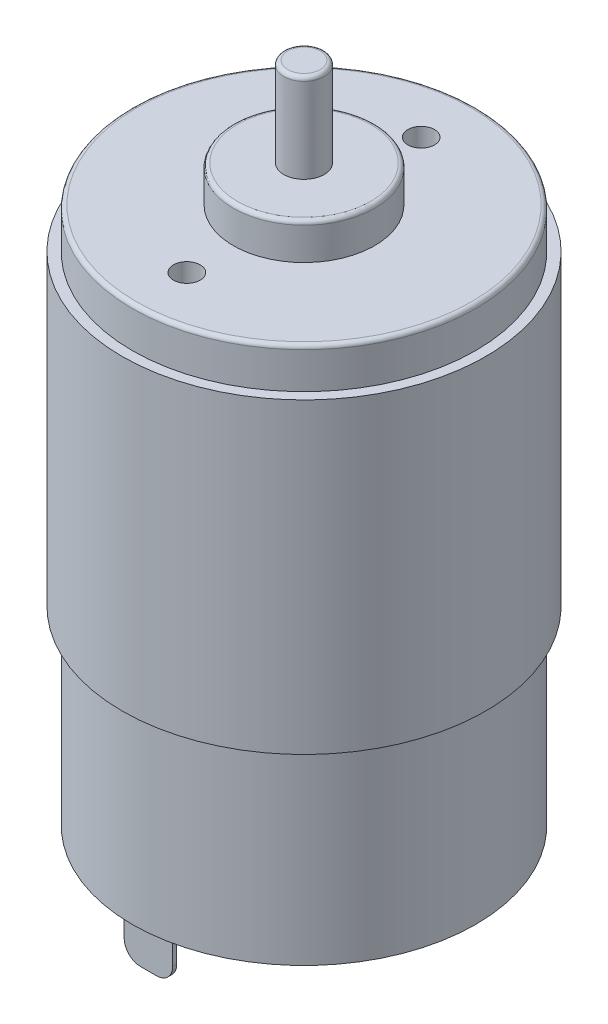
ISO-10303-21;
HEADER;
FILE_DESCRIPTION(('STEP AP214'),'2;1');
FILE_NAME('part.step','',(''),(''),'','','');
FILE_SCHEMA(('AUTOMOTIVE_DESIGN { 1 0 10303 214 1 1 1 1 }'));
ENDSEC;
DATA;
#1=APPLICATION_CONTEXT('core data for automotive mechanical design processes');
#2=APPLICATION_PROTOCOL_DEFINITION('international standard','automotive_design',2000,#1);
#3=PRODUCT_CONTEXT('',#1,'mechanical');
#4=PRODUCT('Part','Part','',(#3));
#5=PRODUCT_RELATED_PRODUCT_CATEGORY('part','',(#4));
#6=PRODUCT_DEFINITION_FORMATION('','',#4);
#7=PRODUCT_DEFINITION_CONTEXT('part definition',#1,'design');
#8=PRODUCT_DEFINITION('design','',#6,#7);
#9=PRODUCT_DEFINITION_SHAPE('','',#8);
#10=(LENGTH_UNIT() NAMED_UNIT(*) SI_UNIT(.MILLI.,.METRE.));
#11=(NAMED_UNIT(*) PLANE_ANGLE_UNIT() SI_UNIT($,.RADIAN.));
#12=(NAMED_UNIT(*) SI_UNIT($,.STERADIAN.) SOLID_ANGLE_UNIT());
#13=UNCERTAINTY_MEASURE_WITH_UNIT(LENGTH_MEASURE(1.E-05),#10,'distance_accuracy_value','');
#14=(GEOMETRIC_REPRESENTATION_CONTEXT(3) GLOBAL_UNCERTAINTY_ASSIGNED_CONTEXT((#13)) GLOBAL_UNIT_ASSIGNED_CONTEXT((#10,
#11,#12)) REPRESENTATION_CONTEXT('',''));
#15=CARTESIAN_POINT('',(0.,0.,0.));
#16=DIRECTION('',(0.,0.,1.));
#17=DIRECTION('',(1.,0.,0.));
#18=AXIS2_PLACEMENT_3D('',#15,#16,#17);
#19=CARTESIAN_POINT('',(21.25,11.5,0.));
#20=DIRECTION('',(0.,-1.,0.));
#21=DIRECTION('',(0.,0.,-1.));
#22=AXIS2_PLACEMENT_3D('',#19,#20,#21);
#23=PLANE('',#22);
#24=CARTESIAN_POINT('',(0.,11.5,0.));
#25=DIRECTION('',(0.,-1.,0.));
#26=DIRECTION('',(0.,0.,-1.));
#27=AXIS2_PLACEMENT_3D('',#24,#25,#26);
#28=CIRCLE('',#27,21.25);
#29=CARTESIAN_POINT('',(0.,11.5,-21.25));
#30=VERTEX_POINT('',#29);
#31=EDGE_CURVE('E196',#30,#30,#28,.T.);
#32=ORIENTED_EDGE('',*,*,#31,.T.);
#33=EDGE_LOOP('',(#32));
#34=FACE_BOUND('',#33,.T.);
#35=CARTESIAN_POINT('',(0.,11.5,0.));
#36=DIRECTION('',(0.,-1.,0.));
#37=DIRECTION('',(0.,0.,-1.));
#38=AXIS2_PLACEMENT_3D('',#35,#36,#37);
#39=CIRCLE('',#38,8.75000000000001);
#40=CARTESIAN_POINT('',(0.,11.5,-8.75000000000001));
#41=VERTEX_POINT('',#40);
#42=EDGE_CURVE('E193',#41,#41,#39,.T.);
#43=ORIENTED_EDGE('',*,*,#42,.F.);
#44=EDGE_LOOP('',(#43));
#45=FACE_BOUND('',#44,.T.);
#46=DIRECTION('',(1.,0.,0.));
#47=VECTOR('',#46,1.);
#48=CARTESIAN_POINT('',(-3.,11.5,18.75));
#49=LINE('',#48,#47);
#50=CARTESIAN_POINT('',(-3.,11.5,18.75));
#51=VERTEX_POINT('',#50);
#52=CARTESIAN_POINT('',(3.,11.5,18.75));
#53=VERTEX_POINT('',#52);
#54=EDGE_CURVE('E175',#51,#53,#49,.T.);
#55=ORIENTED_EDGE('',*,*,#54,.F.);
#56=DIRECTION('',(0.,0.,-1.));
#57=VECTOR('',#56,1.);
#58=CARTESIAN_POINT('',(-3.,11.5,18.75));
#59=LINE('',#58,#57);
#60=CARTESIAN_POINT('',(-3.,11.5,19.25));
#61=VERTEX_POINT('',#60);
#62=EDGE_CURVE('E138',#61,#51,#59,.T.);
#63=ORIENTED_EDGE('',*,*,#62,.F.);
#64=DIRECTION('',(-1.,0.,0.));
#65=VECTOR('',#64,1.);
#66=CARTESIAN_POINT('',(-3.,11.5,19.25));
#67=LINE('',#66,#65);
#68=CARTESIAN_POINT('',(3.,11.5,19.25));
#69=VERTEX_POINT('',#68);
#70=EDGE_CURVE('E169',#69,#61,#67,.T.);
#71=ORIENTED_EDGE('',*,*,#70,.F.);
#72=DIRECTION('',(0.,0.,1.));
#73=VECTOR('',#72,1.);
#74=CARTESIAN_POINT('',(3.,11.5,18.75));
#75=LINE('',#74,#73);
#76=EDGE_CURVE('E178',#53,#69,#75,.T.);
#77=ORIENTED_EDGE('',*,*,#76,.F.);
#78=EDGE_LOOP('',(#55,#63,#71,#77));
#79=FACE_BOUND('',#78,.T.);
#80=DIRECTION('',(1.,0.,0.));
#81=VECTOR('',#80,1.);
#82=CARTESIAN_POINT('',(-3.,11.5,-19.25));
#83=LINE('',#82,#81);
#84=CARTESIAN_POINT('',(-3.,11.5,-19.25));
#85=VERTEX_POINT('',#84);
#86=CARTESIAN_POINT('',(3.,11.5,-19.25));
#87=VERTEX_POINT('',#86);
#88=EDGE_CURVE('E132',#85,#87,#83,.T.);
#89=ORIENTED_EDGE('',*,*,#88,.F.);
#90=DIRECTION('',(0.,0.,-1.));
#91=VECTOR('',#90,1.);
#92=CARTESIAN_POINT('',(-3.,11.5,-19.25));
#93=LINE('',#92,#91);
#94=CARTESIAN_POINT('',(-3.,11.5,-18.75));
#95=VERTEX_POINT('',#94);
#96=EDGE_CURVE('E142',#95,#85,#93,.T.);
#97=ORIENTED_EDGE('',*,*,#96,.F.);
#98=DIRECTION('',(-1.,0.,0.));
#99=VECTOR('',#98,1.);
#100=CARTESIAN_POINT('',(-3.,11.5,-18.75));
#101=LINE('',#100,#99);
#102=CARTESIAN_POINT('',(3.,11.5,-18.75));
#103=VERTEX_POINT('',#102);
#104=EDGE_CURVE('E154',#103,#95,#101,.T.);
#105=ORIENTED_EDGE('',*,*,#104,.F.);
#106=DIRECTION('',(0.,0.,1.));
#107=VECTOR('',#106,1.);
#108=CARTESIAN_POINT('',(3.,11.5,-19.25));
#109=LINE('',#108,#107);
#110=EDGE_CURVE('E152',#87,#103,#109,.T.);
#111=ORIENTED_EDGE('',*,*,#110,.F.);
#112=EDGE_LOOP('',(#89,#97,#105,#111));
#113=FACE_BOUND('',#112,.T.);
#114=ADVANCED_FACE('F38',(#34,#45,#79,#113),#23,.T.);
#115=CARTESIAN_POINT('',(2.50000000000001,0.,0.));
#116=DIRECTION('',(0.,-1.,0.));
#117=DIRECTION('',(0.,0.,-1.));
#118=AXIS2_PLACEMENT_3D('',#115,#116,#117);
#119=PLANE('',#118);
#120=CARTESIAN_POINT('',(0.,0.,0.));
#121=DIRECTION('',(0.,-1.,0.));
#122=DIRECTION('',(0.,0.,-1.));
#123=AXIS2_PLACEMENT_3D('',#120,#121,#122);
#124=CIRCLE('',#123,2.00000000000001);
#125=CARTESIAN_POINT('',(0.,0.,-2.00000000000001));
#126=VERTEX_POINT('',#125);
#127=EDGE_CURVE('E217',#126,#126,#124,.T.);
#128=ORIENTED_EDGE('',*,*,#127,.T.);
#129=EDGE_LOOP('',(#128));
#130=FACE_BOUND('',#129,.T.);
#131=ADVANCED_FACE('F307',(#130),#119,.T.);
#132=CARTESIAN_POINT('',(0.,93.5,0.));
#133=DIRECTION('',(0.,1.,0.));
#134=DIRECTION('',(0.,0.,1.));
#135=AXIS2_PLACEMENT_3D('',#132,#133,#134);
#136=PLANE('',#135);
#137=CARTESIAN_POINT('',(0.,93.5,0.));
#138=DIRECTION('',(0.,1.,0.));
#139=DIRECTION('',(0.,0.,1.));
#140=AXIS2_PLACEMENT_3D('',#137,#138,#139);
#141=CIRCLE('',#140,2.);
#142=CARTESIAN_POINT('',(0.,93.5,2.));
#143=VERTEX_POINT('',#142);
#144=EDGE_CURVE('E244',#143,#143,#141,.T.);
#145=ORIENTED_EDGE('',*,*,#144,.T.);
#146=EDGE_LOOP('',(#145));
#147=FACE_BOUND('',#146,.T.);
#148=ADVANCED_FACE('F315',(#147),#136,.T.);
#149=CARTESIAN_POINT('',(0.,0.,0.));
#150=DIRECTION('',(0.,-1.,0.));
#151=DIRECTION('',(0.,0.,-1.));
#152=AXIS2_PLACEMENT_3D('',#149,#150,#151);
#153=CYLINDRICAL_SURFACE('',#152,2.5);
#154=CARTESIAN_POINT('',(0.,93.,0.));
#155=DIRECTION('',(0.,1.,0.));
#156=DIRECTION('',(0.,0.,1.));
#157=AXIS2_PLACEMENT_3D('',#154,#155,#156);
#158=CIRCLE('',#157,2.5);
#159=CARTESIAN_POINT('',(0.,93.,2.5));
#160=VERTEX_POINT('',#159);
#161=EDGE_CURVE('E241',#160,#160,#158,.F.);
#162=ORIENTED_EDGE('',*,*,#161,.T.);
#163=EDGE_LOOP('',(#162));
#164=FACE_BOUND('',#163,.T.);
#165=CARTESIAN_POINT('',(0.,82.5,0.));
#166=DIRECTION('',(0.,-1.,0.));
#167=DIRECTION('',(0.,0.,-1.));
#168=AXIS2_PLACEMENT_3D('',#165,#166,#167);
#169=CIRCLE('',#168,2.5);
#170=CARTESIAN_POINT('',(0.,82.5,-2.5));
#171=VERTEX_POINT('',#170);
#172=EDGE_CURVE('E214',#171,#171,#169,.T.);
#173=ORIENTED_EDGE('',*,*,#172,.F.);
#174=EDGE_LOOP('',(#173));
#175=FACE_BOUND('',#174,.T.);
#176=ADVANCED_FACE('F354',(#164,#175),#153,.T.);
#177=CARTESIAN_POINT('',(2.5,82.5,0.));
#178=DIRECTION('',(0.,1.,0.));
#179=DIRECTION('',(0.,0.,1.));
#180=AXIS2_PLACEMENT_3D('',#177,#178,#179);
#181=PLANE('',#180);
#182=CARTESIAN_POINT('',(0.,82.5,0.));
#183=DIRECTION('',(0.,1.,0.));
#184=DIRECTION('',(0.,0.,1.));
#185=AXIS2_PLACEMENT_3D('',#182,#183,#184);
#186=CIRCLE('',#185,8.25);
#187=CARTESIAN_POINT('',(0.,82.5,8.25));
#188=VERTEX_POINT('',#187);
#189=EDGE_CURVE('E238',#188,#188,#186,.T.);
#190=ORIENTED_EDGE('',*,*,#189,.T.);
#191=EDGE_LOOP('',(#190));
#192=FACE_BOUND('',#191,.T.);
#193=ORIENTED_EDGE('',*,*,#172,.T.);
#194=EDGE_LOOP('',(#193));
#195=FACE_BOUND('',#194,.T.);
#196=ADVANCED_FACE('F350',(#192,#195),#181,.T.);
#197=CARTESIAN_POINT('',(0.,0.,0.));
#198=DIRECTION('',(0.,-1.,0.));
#199=DIRECTION('',(0.,0.,-1.));
#200=AXIS2_PLACEMENT_3D('',#197,#198,#199);
#201=CYLINDRICAL_SURFACE('',#200,8.75);
#202=CARTESIAN_POINT('',(0.,82.,0.));
#203=DIRECTION('',(0.,1.,0.));
#204=DIRECTION('',(0.,0.,1.));
#205=AXIS2_PLACEMENT_3D('',#202,#203,#204);
#206=CIRCLE('',#205,8.75);
#207=CARTESIAN_POINT('',(0.,82.,8.75));
#208=VERTEX_POINT('',#207);
#209=EDGE_CURVE('E235',#208,#208,#206,.F.);
#210=ORIENTED_EDGE('',*,*,#209,.T.);
#211=EDGE_LOOP('',(#210));
#212=FACE_BOUND('',#211,.T.);
#213=CARTESIAN_POINT('',(0.,78.,0.));
#214=DIRECTION('',(0.,-1.,0.));
#215=DIRECTION('',(0.,0.,-1.));
#216=AXIS2_PLACEMENT_3D('',#213,#214,#215);
#217=CIRCLE('',#216,8.75);
#218=CARTESIAN_POINT('',(0.,78.,-8.75));
#219=VERTEX_POINT('',#218);
#220=EDGE_CURVE('E211',#219,#219,#217,.T.);
#221=ORIENTED_EDGE('',*,*,#220,.F.);
#222=EDGE_LOOP('',(#221));
#223=FACE_BOUND('',#222,.T.);
#224=ADVANCED_FACE('F346',(#212,#223),#201,.T.);
#225=CARTESIAN_POINT('',(8.75,78.,0.));
#226=DIRECTION('',(0.,1.,0.));
#227=DIRECTION('',(0.,0.,1.));
#228=AXIS2_PLACEMENT_3D('',#225,#226,#227);
#229=PLANE('',#228);
#230=CARTESIAN_POINT('',(0.,78.,0.));
#231=DIRECTION('',(0.,1.,0.));
#232=DIRECTION('',(0.,0.,1.));
#233=AXIS2_PLACEMENT_3D('',#230,#231,#232);
#234=CIRCLE('',#233,20.75);
#235=CARTESIAN_POINT('',(0.,78.,20.75));
#236=VERTEX_POINT('',#235);
#237=EDGE_CURVE('E232',#236,#236,#234,.T.);
#238=ORIENTED_EDGE('',*,*,#237,.T.);
#239=EDGE_LOOP('',(#238));
#240=FACE_BOUND('',#239,.T.);
#241=CARTESIAN_POINT('',(0.,78.,14.5));
#242=DIRECTION('',(0.,1.,0.));
#243=DIRECTION('',(0.,0.,1.));
#244=AXIS2_PLACEMENT_3D('',#241,#242,#243);
#245=CIRCLE('',#244,1.65);
#246=CARTESIAN_POINT('',(0.,78.,16.15));
#247=VERTEX_POINT('',#246);
#248=EDGE_CURVE('E633',#247,#247,#245,.T.);
#249=ORIENTED_EDGE('',*,*,#248,.F.);
#250=EDGE_LOOP('',(#249));
#251=FACE_BOUND('',#250,.T.);
#252=CARTESIAN_POINT('',(0.,78.,-14.5));
#253=DIRECTION('',(0.,1.,0.));
#254=DIRECTION('',(0.,0.,1.));
#255=AXIS2_PLACEMENT_3D('',#252,#253,#254);
#256=CIRCLE('',#255,1.65);
#257=CARTESIAN_POINT('',(0.,78.,-12.85));
#258=VERTEX_POINT('',#257);
#259=EDGE_CURVE('E630',#258,#258,#256,.T.);
#260=ORIENTED_EDGE('',*,*,#259,.F.);
#261=EDGE_LOOP('',(#260));
#262=FACE_BOUND('',#261,.T.);
#263=ORIENTED_EDGE('',*,*,#220,.T.);
#264=EDGE_LOOP('',(#263));
#265=FACE_BOUND('',#264,.T.);
#266=ADVANCED_FACE('F342',(#240,#251,#262,#265),#229,.T.);
#267=CARTESIAN_POINT('',(0.,0.,0.));
#268=DIRECTION('',(0.,-1.,0.));
#269=DIRECTION('',(0.,0.,-1.));
#270=AXIS2_PLACEMENT_3D('',#267,#268,#269);
#271=CYLINDRICAL_SURFACE('',#270,21.25);
#272=CARTESIAN_POINT('',(0.,77.5,0.));
#273=DIRECTION('',(0.,1.,0.));
#274=DIRECTION('',(0.,0.,1.));
#275=AXIS2_PLACEMENT_3D('',#272,#273,#274);
#276=CIRCLE('',#275,21.25);
#277=CARTESIAN_POINT('',(0.,77.5,21.25));
#278=VERTEX_POINT('',#277);
#279=EDGE_CURVE('E229',#278,#278,#276,.F.);
#280=ORIENTED_EDGE('',*,*,#279,.T.);
#281=EDGE_LOOP('',(#280));
#282=FACE_BOUND('',#281,.T.);
#283=CARTESIAN_POINT('',(0.,73.,0.));
#284=DIRECTION('',(0.,-1.,0.));
#285=DIRECTION('',(0.,0.,-1.));
#286=AXIS2_PLACEMENT_3D('',#283,#284,#285);
#287=CIRCLE('',#286,21.25);
#288=CARTESIAN_POINT('',(0.,73.,-21.25));
#289=VERTEX_POINT('',#288);
#290=EDGE_CURVE('E208',#289,#289,#287,.T.);
#291=ORIENTED_EDGE('',*,*,#290,.F.);
#292=EDGE_LOOP('',(#291));
#293=FACE_BOUND('',#292,.T.);
#294=ADVANCED_FACE('F338',(#282,#293),#271,.T.);
#295=CARTESIAN_POINT('',(21.25,73.,0.));
#296=DIRECTION('',(0.,1.,0.));
#297=DIRECTION('',(0.,0.,1.));
#298=AXIS2_PLACEMENT_3D('',#295,#296,#297);
#299=PLANE('',#298);
#300=ORIENTED_EDGE('',*,*,#290,.T.);
#301=EDGE_LOOP('',(#300));
#302=FACE_BOUND('',#301,.T.);
#303=CARTESIAN_POINT('',(0.,73.,0.));
#304=DIRECTION('',(0.,-1.,0.));
#305=DIRECTION('',(0.,0.,-1.));
#306=AXIS2_PLACEMENT_3D('',#303,#304,#305);
#307=CIRCLE('',#306,22.5);
#308=CARTESIAN_POINT('',(0.,73.,-22.5));
#309=VERTEX_POINT('',#308);
#310=EDGE_CURVE('E205',#309,#309,#307,.T.);
#311=ORIENTED_EDGE('',*,*,#310,.F.);
#312=EDGE_LOOP('',(#311));
#313=FACE_BOUND('',#312,.T.);
#314=ADVANCED_FACE('F334',(#302,#313),#299,.T.);
#315=CARTESIAN_POINT('',(0.,0.,0.));
#316=DIRECTION('',(0.,-1.,0.));
#317=DIRECTION('',(0.,0.,-1.));
#318=AXIS2_PLACEMENT_3D('',#315,#316,#317);
#319=CYLINDRICAL_SURFACE('',#318,22.5);
#320=ORIENTED_EDGE('',*,*,#310,.T.);
#321=EDGE_LOOP('',(#320));
#322=FACE_BOUND('',#321,.T.);
#323=CARTESIAN_POINT('',(0.,35.,0.));
#324=DIRECTION('',(0.,-1.,0.));
#325=DIRECTION('',(0.,0.,-1.));
#326=AXIS2_PLACEMENT_3D('',#323,#324,#325);
#327=CIRCLE('',#326,22.5);
#328=CARTESIAN_POINT('',(0.,35.,-22.5));
#329=VERTEX_POINT('',#328);
#330=EDGE_CURVE('E202',#329,#329,#327,.T.);
#331=ORIENTED_EDGE('',*,*,#330,.F.);
#332=EDGE_LOOP('',(#331));
#333=FACE_BOUND('',#332,.T.);
#334=ADVANCED_FACE('F330',(#322,#333),#319,.T.);
#335=CARTESIAN_POINT('',(22.5,35.,0.));
#336=DIRECTION('',(0.,-1.,0.));
#337=DIRECTION('',(0.,0.,-1.));
#338=AXIS2_PLACEMENT_3D('',#335,#336,#337);
#339=PLANE('',#338);
#340=ORIENTED_EDGE('',*,*,#330,.T.);
#341=EDGE_LOOP('',(#340));
#342=FACE_BOUND('',#341,.T.);
#343=CARTESIAN_POINT('',(0.,35.,0.));
#344=DIRECTION('',(0.,-1.,0.));
#345=DIRECTION('',(0.,0.,-1.));
#346=AXIS2_PLACEMENT_3D('',#343,#344,#345);
#347=CIRCLE('',#346,21.25);
#348=CARTESIAN_POINT('',(0.,35.,-21.25));
#349=VERTEX_POINT('',#348);
#350=EDGE_CURVE('E199',#349,#349,#347,.T.);
#351=ORIENTED_EDGE('',*,*,#350,.F.);
#352=EDGE_LOOP('',(#351));
#353=FACE_BOUND('',#352,.T.);
#354=ADVANCED_FACE('F326',(#342,#353),#339,.T.);
#355=CARTESIAN_POINT('',(0.,0.,0.));
#356=DIRECTION('',(0.,-1.,0.));
#357=DIRECTION('',(0.,0.,-1.));
#358=AXIS2_PLACEMENT_3D('',#355,#356,#357);
#359=CYLINDRICAL_SURFACE('',#358,21.25);
#360=ORIENTED_EDGE('',*,*,#350,.T.);
#361=EDGE_LOOP('',(#360));
#362=FACE_BOUND('',#361,.T.);
#363=ORIENTED_EDGE('',*,*,#31,.F.);
#364=EDGE_LOOP('',(#363));
#365=FACE_BOUND('',#364,.T.);
#366=ADVANCED_FACE('F323',(#362,#365),#359,.T.);
#367=CARTESIAN_POINT('',(0.,0.,0.));
#368=DIRECTION('',(0.,-1.,0.));
#369=DIRECTION('',(0.,0.,-1.));
#370=AXIS2_PLACEMENT_3D('',#367,#368,#369);
#371=CYLINDRICAL_SURFACE('',#370,8.75000000000001);
#372=CARTESIAN_POINT('',(0.,7.99999999999999,0.));
#373=DIRECTION('',(0.,-1.,0.));
#374=DIRECTION('',(0.,0.,-1.));
#375=AXIS2_PLACEMENT_3D('',#372,#373,#374);
#376=CIRCLE('',#375,8.75000000000001);
#377=CARTESIAN_POINT('',(0.,7.99999999999999,-8.75000000000001));
#378=VERTEX_POINT('',#377);
#379=EDGE_CURVE('E226',#378,#378,#376,.F.);
#380=ORIENTED_EDGE('',*,*,#379,.T.);
#381=EDGE_LOOP('',(#380));
#382=FACE_BOUND('',#381,.T.);
#383=ORIENTED_EDGE('',*,*,#42,.T.);
#384=EDGE_LOOP('',(#383));
#385=FACE_BOUND('',#384,.T.);
#386=ADVANCED_FACE('F321',(#382,#385),#371,.T.);
#387=CARTESIAN_POINT('',(8.75000000000001,7.49999999999999,0.));
#388=DIRECTION('',(0.,-1.,0.));
#389=DIRECTION('',(0.,0.,-1.));
#390=AXIS2_PLACEMENT_3D('',#387,#388,#389);
#391=PLANE('',#390);
#392=CARTESIAN_POINT('',(0.,7.49999999999999,0.));
#393=DIRECTION('',(0.,-1.,0.));
#394=DIRECTION('',(0.,0.,-1.));
#395=AXIS2_PLACEMENT_3D('',#392,#393,#394);
#396=CIRCLE('',#395,8.25000000000001);
#397=CARTESIAN_POINT('',(0.,7.49999999999999,-8.25000000000001));
#398=VERTEX_POINT('',#397);
#399=EDGE_CURVE('E223',#398,#398,#396,.T.);
#400=ORIENTED_EDGE('',*,*,#399,.T.);
#401=EDGE_LOOP('',(#400));
#402=FACE_BOUND('',#401,.T.);
#403=CARTESIAN_POINT('',(0.,7.49999999999999,0.));
#404=DIRECTION('',(0.,-1.,0.));
#405=DIRECTION('',(0.,0.,-1.));
#406=AXIS2_PLACEMENT_3D('',#403,#404,#405);
#407=CIRCLE('',#406,2.50000000000001);
#408=CARTESIAN_POINT('',(0.,7.49999999999999,-2.50000000000001));
#409=VERTEX_POINT('',#408);
#410=EDGE_CURVE('E190',#409,#409,#407,.T.);
#411=ORIENTED_EDGE('',*,*,#410,.F.);
#412=EDGE_LOOP('',(#411));
#413=FACE_BOUND('',#412,.T.);
#414=ADVANCED_FACE('F496',(#402,#413),#391,.T.);
#415=CARTESIAN_POINT('',(0.,0.,0.));
#416=DIRECTION('',(0.,-1.,0.));
#417=DIRECTION('',(0.,0.,-1.));
#418=AXIS2_PLACEMENT_3D('',#415,#416,#417);
#419=CYLINDRICAL_SURFACE('',#418,2.50000000000001);
#420=CARTESIAN_POINT('',(0.,0.5,0.));
#421=DIRECTION('',(0.,-1.,0.));
#422=DIRECTION('',(0.,0.,-1.));
#423=AXIS2_PLACEMENT_3D('',#420,#421,#422);
#424=CIRCLE('',#423,2.50000000000001);
#425=CARTESIAN_POINT('',(0.,0.5,-2.50000000000001));
#426=VERTEX_POINT('',#425);
#427=EDGE_CURVE('E220',#426,#426,#424,.F.);
#428=ORIENTED_EDGE('',*,*,#427,.T.);
#429=EDGE_LOOP('',(#428));
#430=FACE_BOUND('',#429,.T.);
#431=ORIENTED_EDGE('',*,*,#410,.T.);
#432=EDGE_LOOP('',(#431));
#433=FACE_BOUND('',#432,.T.);
#434=ADVANCED_FACE('F481',(#430,#433),#419,.T.);
#435=CARTESIAN_POINT('',(-3.,5.5,18.75));
#436=DIRECTION('',(1.,0.,0.));
#437=DIRECTION('',(0.,0.,-1.));
#438=AXIS2_PLACEMENT_3D('',#435,#436,#437);
#439=PLANE('',#438);
#440=DIRECTION('',(0.,1.,0.));
#441=VECTOR('',#440,1.);
#442=CARTESIAN_POINT('',(-3.,5.5,18.75));
#443=LINE('',#442,#441);
#444=CARTESIAN_POINT('',(-3.,7.5,18.75));
#445=VERTEX_POINT('',#444);
#446=EDGE_CURVE('E188',#445,#51,#443,.T.);
#447=ORIENTED_EDGE('',*,*,#446,.F.);
#448=DIRECTION('',(0.,0.,-1.));
#449=VECTOR('',#448,1.);
#450=CARTESIAN_POINT('',(-3.,7.5,18.75));
#451=LINE('',#450,#449);
#452=CARTESIAN_POINT('',(-3.,7.5,19.25));
#453=VERTEX_POINT('',#452);
#454=EDGE_CURVE('E61',#445,#453,#451,.F.);
#455=ORIENTED_EDGE('',*,*,#454,.T.);
#456=DIRECTION('',(0.,1.,0.));
#457=VECTOR('',#456,1.);
#458=CARTESIAN_POINT('',(-3.,5.5,19.25));
#459=LINE('',#458,#457);
#460=EDGE_CURVE('E172',#453,#61,#459,.T.);
#461=ORIENTED_EDGE('',*,*,#460,.T.);
#462=ORIENTED_EDGE('',*,*,#62,.T.);
#463=EDGE_LOOP('',(#447,#455,#461,#462));
#464=FACE_BOUND('',#463,.T.);
#465=ADVANCED_FACE('F286',(#464),#439,.F.);
#466=CARTESIAN_POINT('',(-3.,5.5,18.75));
#467=DIRECTION('',(0.,0.,1.));
#468=DIRECTION('',(1.,0.,0.));
#469=AXIS2_PLACEMENT_3D('',#466,#467,#468);
#470=PLANE('',#469);
#471=DIRECTION('',(1.,0.,0.));
#472=VECTOR('',#471,1.);
#473=CARTESIAN_POINT('',(-3.,5.5,18.75));
#474=LINE('',#473,#472);
#475=CARTESIAN_POINT('',(-1.,5.5,18.75));
#476=VERTEX_POINT('',#475);
#477=CARTESIAN_POINT('',(1.,5.5,18.75));
#478=VERTEX_POINT('',#477);
#479=EDGE_CURVE('E165',#476,#478,#474,.T.);
#480=ORIENTED_EDGE('',*,*,#479,.F.);
#481=CARTESIAN_POINT('',(-1.,7.5,18.75));
#482=DIRECTION('',(0.,0.,1.));
#483=DIRECTION('',(1.,0.,0.));
#484=AXIS2_PLACEMENT_3D('',#481,#482,#483);
#485=CIRCLE('',#484,2.);
#486=EDGE_CURVE('E272',#476,#445,#485,.F.);
#487=ORIENTED_EDGE('',*,*,#486,.T.);
#488=ORIENTED_EDGE('',*,*,#446,.T.);
#489=ORIENTED_EDGE('',*,*,#54,.T.);
#490=DIRECTION('',(0.,1.,0.));
#491=VECTOR('',#490,1.);
#492=CARTESIAN_POINT('',(3.,5.5,18.75));
#493=LINE('',#492,#491);
#494=CARTESIAN_POINT('',(3.,7.5,18.75));
#495=VERTEX_POINT('',#494);
#496=EDGE_CURVE('E186',#495,#53,#493,.T.);
#497=ORIENTED_EDGE('',*,*,#496,.F.);
#498=CARTESIAN_POINT('',(1.,7.5,18.75));
#499=DIRECTION('',(0.,0.,1.));
#500=DIRECTION('',(1.,0.,0.));
#501=AXIS2_PLACEMENT_3D('',#498,#499,#500);
#502=CIRCLE('',#501,2.);
#503=EDGE_CURVE('E270',#495,#478,#502,.F.);
#504=ORIENTED_EDGE('',*,*,#503,.T.);
#505=EDGE_LOOP('',(#480,#487,#488,#489,#497,#504));
#506=FACE_BOUND('',#505,.T.);
#507=ADVANCED_FACE('F285',(#506),#470,.F.);
#508=CARTESIAN_POINT('',(3.,5.5,18.75));
#509=DIRECTION('',(-1.,0.,0.));
#510=DIRECTION('',(0.,0.,1.));
#511=AXIS2_PLACEMENT_3D('',#508,#509,#510);
#512=PLANE('',#511);
#513=DIRECTION('',(0.,1.,0.));
#514=VECTOR('',#513,1.);
#515=CARTESIAN_POINT('',(3.,5.5,19.25));
#516=LINE('',#515,#514);
#517=CARTESIAN_POINT('',(3.,7.5,19.25));
#518=VERTEX_POINT('',#517);
#519=EDGE_CURVE('E184',#518,#69,#516,.T.);
#520=ORIENTED_EDGE('',*,*,#519,.F.);
#521=DIRECTION('',(0.,0.,1.));
#522=VECTOR('',#521,1.);
#523=CARTESIAN_POINT('',(3.,7.5,18.75));
#524=LINE('',#523,#522);
#525=EDGE_CURVE('E11',#518,#495,#524,.F.);
#526=ORIENTED_EDGE('',*,*,#525,.T.);
#527=ORIENTED_EDGE('',*,*,#496,.T.);
#528=ORIENTED_EDGE('',*,*,#76,.T.);
#529=EDGE_LOOP('',(#520,#526,#527,#528));
#530=FACE_BOUND('',#529,.T.);
#531=ADVANCED_FACE('F297',(#530),#512,.F.);
#532=CARTESIAN_POINT('',(-3.,5.5,19.25));
#533=DIRECTION('',(0.,0.,-1.));
#534=DIRECTION('',(-1.,0.,0.));
#535=AXIS2_PLACEMENT_3D('',#532,#533,#534);
#536=PLANE('',#535);
#537=ORIENTED_EDGE('',*,*,#460,.F.);
#538=CARTESIAN_POINT('',(-1.,7.5,19.25));
#539=DIRECTION('',(0.,0.,-1.));
#540=DIRECTION('',(-1.,0.,0.));
#541=AXIS2_PLACEMENT_3D('',#538,#539,#540);
#542=CIRCLE('',#541,2.);
#543=CARTESIAN_POINT('',(-1.,5.5,19.25));
#544=VERTEX_POINT('',#543);
#545=EDGE_CURVE('E46',#453,#544,#542,.F.);
#546=ORIENTED_EDGE('',*,*,#545,.T.);
#547=DIRECTION('',(-1.,0.,0.));
#548=VECTOR('',#547,1.);
#549=CARTESIAN_POINT('',(-3.,5.5,19.25));
#550=LINE('',#549,#548);
#551=CARTESIAN_POINT('',(1.,5.5,19.25));
#552=VERTEX_POINT('',#551);
#553=EDGE_CURVE('E168',#552,#544,#550,.T.);
#554=ORIENTED_EDGE('',*,*,#553,.F.);
#555=CARTESIAN_POINT('',(1.,7.5,19.25));
#556=DIRECTION('',(0.,0.,-1.));
#557=DIRECTION('',(-1.,0.,0.));
#558=AXIS2_PLACEMENT_3D('',#555,#556,#557);
#559=CIRCLE('',#558,2.);
#560=EDGE_CURVE('E53',#552,#518,#559,.F.);
#561=ORIENTED_EDGE('',*,*,#560,.T.);
#562=ORIENTED_EDGE('',*,*,#519,.T.);
#563=ORIENTED_EDGE('',*,*,#70,.T.);
#564=EDGE_LOOP('',(#537,#546,#554,#561,#562,#563));
#565=FACE_BOUND('',#564,.T.);
#566=ADVANCED_FACE('F276',(#565),#536,.F.);
#567=CARTESIAN_POINT('',(0.,5.5,0.));
#568=DIRECTION('',(0.,1.,0.));
#569=DIRECTION('',(0.,0.,1.));
#570=AXIS2_PLACEMENT_3D('',#567,#568,#569);
#571=PLANE('',#570);
#572=ORIENTED_EDGE('',*,*,#553,.T.);
#573=DIRECTION('',(0.,0.,-1.));
#574=VECTOR('',#573,1.);
#575=CARTESIAN_POINT('',(-1.,5.5,0.));
#576=LINE('',#575,#574);
#577=EDGE_CURVE('E267',#544,#476,#576,.T.);
#578=ORIENTED_EDGE('',*,*,#577,.T.);
#579=ORIENTED_EDGE('',*,*,#479,.T.);
#580=DIRECTION('',(0.,0.,1.));
#581=VECTOR('',#580,1.);
#582=CARTESIAN_POINT('',(1.,5.5,0.));
#583=LINE('',#582,#581);
#584=EDGE_CURVE('E264',#478,#552,#583,.T.);
#585=ORIENTED_EDGE('',*,*,#584,.T.);
#586=EDGE_LOOP('',(#572,#578,#579,#585));
#587=FACE_BOUND('',#586,.T.);
#588=ADVANCED_FACE('F280',(#587),#571,.F.);
#589=CARTESIAN_POINT('',(-3.,5.5,-19.25));
#590=DIRECTION('',(1.,0.,0.));
#591=DIRECTION('',(0.,0.,-1.));
#592=AXIS2_PLACEMENT_3D('',#589,#590,#591);
#593=PLANE('',#592);
#594=DIRECTION('',(0.,1.,0.));
#595=VECTOR('',#594,1.);
#596=CARTESIAN_POINT('',(-3.,5.5,-19.25));
#597=LINE('',#596,#595);
#598=CARTESIAN_POINT('',(-3.,7.5,-19.25));
#599=VERTEX_POINT('',#598);
#600=EDGE_CURVE('E127',#599,#85,#597,.T.);
#601=ORIENTED_EDGE('',*,*,#600,.F.);
#602=DIRECTION('',(0.,0.,-1.));
#603=VECTOR('',#602,1.);
#604=CARTESIAN_POINT('',(-3.,7.5,-19.25));
#605=LINE('',#604,#603);
#606=CARTESIAN_POINT('',(-3.,7.5,-18.75));
#607=VERTEX_POINT('',#606);
#608=EDGE_CURVE('E262',#599,#607,#605,.F.);
#609=ORIENTED_EDGE('',*,*,#608,.T.);
#610=DIRECTION('',(0.,1.,0.));
#611=VECTOR('',#610,1.);
#612=CARTESIAN_POINT('',(-3.,5.5,-18.75));
#613=LINE('',#612,#611);
#614=EDGE_CURVE('E145',#607,#95,#613,.T.);
#615=ORIENTED_EDGE('',*,*,#614,.T.);
#616=ORIENTED_EDGE('',*,*,#96,.T.);
#617=EDGE_LOOP('',(#601,#609,#615,#616));
#618=FACE_BOUND('',#617,.T.);
#619=ADVANCED_FACE('F143',(#618),#593,.F.);
#620=CARTESIAN_POINT('',(-3.,5.5,-19.25));
#621=DIRECTION('',(0.,0.,1.));
#622=DIRECTION('',(1.,0.,0.));
#623=AXIS2_PLACEMENT_3D('',#620,#621,#622);
#624=PLANE('',#623);
#625=DIRECTION('',(0.,1.,0.));
#626=VECTOR('',#625,1.);
#627=CARTESIAN_POINT('',(3.,5.5,-19.25));
#628=LINE('',#627,#626);
#629=CARTESIAN_POINT('',(3.,7.5,-19.25));
#630=VERTEX_POINT('',#629);
#631=EDGE_CURVE('E139',#630,#87,#628,.T.);
#632=ORIENTED_EDGE('',*,*,#631,.F.);
#633=CARTESIAN_POINT('',(1.,7.5,-19.25));
#634=DIRECTION('',(0.,0.,1.));
#635=DIRECTION('',(1.,0.,0.));
#636=AXIS2_PLACEMENT_3D('',#633,#634,#635);
#637=CIRCLE('',#636,2.);
#638=CARTESIAN_POINT('',(1.,5.5,-19.25));
#639=VERTEX_POINT('',#638);
#640=EDGE_CURVE('E260',#630,#639,#637,.F.);
#641=ORIENTED_EDGE('',*,*,#640,.T.);
#642=DIRECTION('',(1.,0.,0.));
#643=VECTOR('',#642,1.);
#644=CARTESIAN_POINT('',(-3.,5.5,-19.25));
#645=LINE('',#644,#643);
#646=CARTESIAN_POINT('',(-1.,5.5,-19.25));
#647=VERTEX_POINT('',#646);
#648=EDGE_CURVE('E159',#647,#639,#645,.T.);
#649=ORIENTED_EDGE('',*,*,#648,.F.);
#650=CARTESIAN_POINT('',(-1.,7.5,-19.25));
#651=DIRECTION('',(0.,0.,1.));
#652=DIRECTION('',(1.,0.,0.));
#653=AXIS2_PLACEMENT_3D('',#650,#651,#652);
#654=CIRCLE('',#653,2.);
#655=EDGE_CURVE('E135',#647,#599,#654,.F.);
#656=ORIENTED_EDGE('',*,*,#655,.T.);
#657=ORIENTED_EDGE('',*,*,#600,.T.);
#658=ORIENTED_EDGE('',*,*,#88,.T.);
#659=EDGE_LOOP('',(#632,#641,#649,#656,#657,#658));
#660=FACE_BOUND('',#659,.T.);
#661=ADVANCED_FACE('F130',(#660),#624,.F.);
#662=CARTESIAN_POINT('',(3.,5.5,-19.25));
#663=DIRECTION('',(-1.,0.,0.));
#664=DIRECTION('',(0.,0.,1.));
#665=AXIS2_PLACEMENT_3D('',#662,#663,#664);
#666=PLANE('',#665);
#667=DIRECTION('',(0.,1.,0.));
#668=VECTOR('',#667,1.);
#669=CARTESIAN_POINT('',(3.,5.5,-18.75));
#670=LINE('',#669,#668);
#671=CARTESIAN_POINT('',(3.,7.5,-18.75));
#672=VERTEX_POINT('',#671);
#673=EDGE_CURVE('E161',#672,#103,#670,.T.);
#674=ORIENTED_EDGE('',*,*,#673,.F.);
#675=DIRECTION('',(0.,0.,1.));
#676=VECTOR('',#675,1.);
#677=CARTESIAN_POINT('',(3.,7.5,-19.25));
#678=LINE('',#677,#676);
#679=EDGE_CURVE('E257',#672,#630,#678,.F.);
#680=ORIENTED_EDGE('',*,*,#679,.T.);
#681=ORIENTED_EDGE('',*,*,#631,.T.);
#682=ORIENTED_EDGE('',*,*,#110,.T.);
#683=EDGE_LOOP('',(#674,#680,#681,#682));
#684=FACE_BOUND('',#683,.T.);
#685=ADVANCED_FACE('F432',(#684),#666,.F.);
#686=CARTESIAN_POINT('',(-3.,5.5,-18.75));
#687=DIRECTION('',(0.,0.,-1.));
#688=DIRECTION('',(-1.,0.,0.));
#689=AXIS2_PLACEMENT_3D('',#686,#687,#688);
#690=PLANE('',#689);
#691=DIRECTION('',(-1.,0.,0.));
#692=VECTOR('',#691,1.);
#693=CARTESIAN_POINT('',(-3.,5.5,-18.75));
#694=LINE('',#693,#692);
#695=CARTESIAN_POINT('',(1.,5.5,-18.75));
#696=VERTEX_POINT('',#695);
#697=CARTESIAN_POINT('',(-1.,5.5,-18.75));
#698=VERTEX_POINT('',#697);
#699=EDGE_CURVE('E162',#696,#698,#694,.T.);
#700=ORIENTED_EDGE('',*,*,#699,.F.);
#701=CARTESIAN_POINT('',(1.,7.5,-18.75));
#702=DIRECTION('',(0.,0.,-1.));
#703=DIRECTION('',(-1.,0.,0.));
#704=AXIS2_PLACEMENT_3D('',#701,#702,#703);
#705=CIRCLE('',#704,2.);
#706=EDGE_CURVE('E255',#696,#672,#705,.F.);
#707=ORIENTED_EDGE('',*,*,#706,.T.);
#708=ORIENTED_EDGE('',*,*,#673,.T.);
#709=ORIENTED_EDGE('',*,*,#104,.T.);
#710=ORIENTED_EDGE('',*,*,#614,.F.);
#711=CARTESIAN_POINT('',(-1.,7.5,-18.75));
#712=DIRECTION('',(0.,0.,-1.));
#713=DIRECTION('',(-1.,0.,0.));
#714=AXIS2_PLACEMENT_3D('',#711,#712,#713);
#715=CIRCLE('',#714,2.);
#716=EDGE_CURVE('E253',#607,#698,#715,.F.);
#717=ORIENTED_EDGE('',*,*,#716,.T.);
#718=EDGE_LOOP('',(#700,#707,#708,#709,#710,#717));
#719=FACE_BOUND('',#718,.T.);
#720=ADVANCED_FACE('F423',(#719),#690,.F.);
#721=CARTESIAN_POINT('',(0.,5.5,0.));
#722=DIRECTION('',(0.,1.,0.));
#723=DIRECTION('',(0.,0.,1.));
#724=AXIS2_PLACEMENT_3D('',#721,#722,#723);
#725=PLANE('',#724);
#726=ORIENTED_EDGE('',*,*,#648,.T.);
#727=DIRECTION('',(0.,0.,1.));
#728=VECTOR('',#727,1.);
#729=CARTESIAN_POINT('',(1.,5.5,0.));
#730=LINE('',#729,#728);
#731=EDGE_CURVE('E250',#639,#696,#730,.T.);
#732=ORIENTED_EDGE('',*,*,#731,.T.);
#733=ORIENTED_EDGE('',*,*,#699,.T.);
#734=DIRECTION('',(0.,0.,-1.));
#735=VECTOR('',#734,1.);
#736=CARTESIAN_POINT('',(-1.,5.5,0.));
#737=LINE('',#736,#735);
#738=EDGE_CURVE('E247',#698,#647,#737,.T.);
#739=ORIENTED_EDGE('',*,*,#738,.T.);
#740=EDGE_LOOP('',(#726,#732,#733,#739));
#741=FACE_BOUND('',#740,.T.);
#742=ADVANCED_FACE('F418',(#741),#725,.F.);
#743=CARTESIAN_POINT('',(0.,74.5,-14.5));
#744=DIRECTION('',(0.,1.,0.));
#745=DIRECTION('',(0.,0.,1.));
#746=AXIS2_PLACEMENT_3D('',#743,#744,#745);
#747=CYLINDRICAL_SURFACE('',#746,1.65);
#748=CARTESIAN_POINT('',(0.,74.5,-14.5));
#749=DIRECTION('',(0.,1.,0.));
#750=DIRECTION('',(0.,0.,1.));
#751=AXIS2_PLACEMENT_3D('',#748,#749,#750);
#752=CIRCLE('',#751,1.65);
#753=CARTESIAN_POINT('',(0.,74.5,-12.85));
#754=VERTEX_POINT('',#753);
#755=EDGE_CURVE('E627',#754,#754,#752,.T.);
#756=ORIENTED_EDGE('',*,*,#755,.F.);
#757=EDGE_LOOP('',(#756));
#758=FACE_BOUND('',#757,.T.);
#759=ORIENTED_EDGE('',*,*,#259,.T.);
#760=EDGE_LOOP('',(#759));
#761=FACE_BOUND('',#760,.T.);
#762=ADVANCED_FACE('F422',(#758,#761),#747,.F.);
#763=CARTESIAN_POINT('',(0.,74.5,-14.5));
#764=DIRECTION('',(0.,1.,0.));
#765=DIRECTION('',(0.,0.,1.));
#766=AXIS2_PLACEMENT_3D('',#763,#764,#765);
#767=PLANE('',#766);
#768=ORIENTED_EDGE('',*,*,#755,.T.);
#769=EDGE_LOOP('',(#768));
#770=FACE_BOUND('',#769,.T.);
#771=ADVANCED_FACE('F591',(#770),#767,.T.);
#772=CARTESIAN_POINT('',(0.,74.5,14.5));
#773=DIRECTION('',(0.,1.,0.));
#774=DIRECTION('',(0.,0.,1.));
#775=AXIS2_PLACEMENT_3D('',#772,#773,#774);
#776=CYLINDRICAL_SURFACE('',#775,1.65);
#777=CARTESIAN_POINT('',(0.,74.5,14.5));
#778=DIRECTION('',(0.,1.,0.));
#779=DIRECTION('',(0.,0.,1.));
#780=AXIS2_PLACEMENT_3D('',#777,#778,#779);
#781=CIRCLE('',#780,1.65);
#782=CARTESIAN_POINT('',(0.,74.5,16.15));
#783=VERTEX_POINT('',#782);
#784=EDGE_CURVE('E149',#783,#783,#781,.T.);
#785=ORIENTED_EDGE('',*,*,#784,.F.);
#786=EDGE_LOOP('',(#785));
#787=FACE_BOUND('',#786,.T.);
#788=ORIENTED_EDGE('',*,*,#248,.T.);
#789=EDGE_LOOP('',(#788));
#790=FACE_BOUND('',#789,.T.);
#791=ADVANCED_FACE('F580',(#787,#790),#776,.F.);
#792=CARTESIAN_POINT('',(0.,74.5,14.5));
#793=DIRECTION('',(0.,1.,0.));
#794=DIRECTION('',(0.,0.,1.));
#795=AXIS2_PLACEMENT_3D('',#792,#793,#794);
#796=PLANE('',#795);
#797=ORIENTED_EDGE('',*,*,#784,.T.);
#798=EDGE_LOOP('',(#797));
#799=FACE_BOUND('',#798,.T.);
#800=ADVANCED_FACE('F366',(#799),#796,.T.);
#801=CARTESIAN_POINT('',(0.,0.5,0.));
#802=DIRECTION('',(0.,-1.,0.));
#803=DIRECTION('',(0.,0.,-1.));
#804=AXIS2_PLACEMENT_3D('',#801,#802,#803);
#805=TOROIDAL_SURFACE('',#804,2.00000000000001,0.5);
#806=ORIENTED_EDGE('',*,*,#427,.F.);
#807=EDGE_LOOP('',(#806));
#808=FACE_BOUND('',#807,.T.);
#809=ORIENTED_EDGE('',*,*,#127,.F.);
#810=EDGE_LOOP('',(#809));
#811=FACE_BOUND('',#810,.T.);
#812=ADVANCED_FACE('F362',(#808,#811),#805,.T.);
#813=CARTESIAN_POINT('',(0.,7.99999999999999,0.));
#814=DIRECTION('',(0.,-1.,0.));
#815=DIRECTION('',(0.,0.,-1.));
#816=AXIS2_PLACEMENT_3D('',#813,#814,#815);
#817=TOROIDAL_SURFACE('',#816,8.25000000000001,0.5);
#818=ORIENTED_EDGE('',*,*,#379,.F.);
#819=EDGE_LOOP('',(#818));
#820=FACE_BOUND('',#819,.T.);
#821=ORIENTED_EDGE('',*,*,#399,.F.);
#822=EDGE_LOOP('',(#821));
#823=FACE_BOUND('',#822,.T.);
#824=ADVANCED_FACE('F365',(#820,#823),#817,.T.);
#825=CARTESIAN_POINT('',(0.,77.5,0.));
#826=DIRECTION('',(0.,1.,0.));
#827=DIRECTION('',(0.,0.,1.));
#828=AXIS2_PLACEMENT_3D('',#825,#826,#827);
#829=TOROIDAL_SURFACE('',#828,20.75,0.5);
#830=ORIENTED_EDGE('',*,*,#237,.F.);
#831=EDGE_LOOP('',(#830));
#832=FACE_BOUND('',#831,.T.);
#833=ORIENTED_EDGE('',*,*,#279,.F.);
#834=EDGE_LOOP('',(#833));
#835=FACE_BOUND('',#834,.T.);
#836=ADVANCED_FACE('F370',(#832,#835),#829,.T.);
#837=CARTESIAN_POINT('',(0.,82.,0.));
#838=DIRECTION('',(0.,1.,0.));
#839=DIRECTION('',(0.,0.,1.));
#840=AXIS2_PLACEMENT_3D('',#837,#838,#839);
#841=TOROIDAL_SURFACE('',#840,8.25,0.5);
#842=ORIENTED_EDGE('',*,*,#189,.F.);
#843=EDGE_LOOP('',(#842));
#844=FACE_BOUND('',#843,.T.);
#845=ORIENTED_EDGE('',*,*,#209,.F.);
#846=EDGE_LOOP('',(#845));
#847=FACE_BOUND('',#846,.T.);
#848=ADVANCED_FACE('F374',(#844,#847),#841,.T.);
#849=CARTESIAN_POINT('',(0.,93.,0.));
#850=DIRECTION('',(0.,1.,0.));
#851=DIRECTION('',(0.,0.,1.));
#852=AXIS2_PLACEMENT_3D('',#849,#850,#851);
#853=TOROIDAL_SURFACE('',#852,2.,0.5);
#854=ORIENTED_EDGE('',*,*,#144,.F.);
#855=EDGE_LOOP('',(#854));
#856=FACE_BOUND('',#855,.T.);
#857=ORIENTED_EDGE('',*,*,#161,.F.);
#858=EDGE_LOOP('',(#857));
#859=FACE_BOUND('',#858,.T.);
#860=ADVANCED_FACE('F378',(#856,#859),#853,.T.);
#861=CARTESIAN_POINT('',(1.,7.5,0.));
#862=DIRECTION('',(0.,0.,1.));
#863=DIRECTION('',(1.,0.,0.));
#864=AXIS2_PLACEMENT_3D('',#861,#862,#863);
#865=CYLINDRICAL_SURFACE('',#864,2.);
#866=ORIENTED_EDGE('',*,*,#640,.F.);
#867=ORIENTED_EDGE('',*,*,#679,.F.);
#868=ORIENTED_EDGE('',*,*,#706,.F.);
#869=ORIENTED_EDGE('',*,*,#731,.F.);
#870=EDGE_LOOP('',(#866,#867,#868,#869));
#871=FACE_BOUND('',#870,.T.);
#872=ADVANCED_FACE('F382',(#871),#865,.T.);
#873=CARTESIAN_POINT('',(-1.,7.5,0.));
#874=DIRECTION('',(0.,0.,-1.));
#875=DIRECTION('',(-1.,0.,0.));
#876=AXIS2_PLACEMENT_3D('',#873,#874,#875);
#877=CYLINDRICAL_SURFACE('',#876,2.);
#878=ORIENTED_EDGE('',*,*,#716,.F.);
#879=ORIENTED_EDGE('',*,*,#608,.F.);
#880=ORIENTED_EDGE('',*,*,#655,.F.);
#881=ORIENTED_EDGE('',*,*,#738,.F.);
#882=EDGE_LOOP('',(#878,#879,#880,#881));
#883=FACE_BOUND('',#882,.T.);
#884=ADVANCED_FACE('F386',(#883),#877,.T.);
#885=CARTESIAN_POINT('',(-1.,7.5,0.));
#886=DIRECTION('',(0.,0.,-1.));
#887=DIRECTION('',(-1.,0.,0.));
#888=AXIS2_PLACEMENT_3D('',#885,#886,#887);
#889=CYLINDRICAL_SURFACE('',#888,2.);
#890=ORIENTED_EDGE('',*,*,#545,.F.);
#891=ORIENTED_EDGE('',*,*,#454,.F.);
#892=ORIENTED_EDGE('',*,*,#486,.F.);
#893=ORIENTED_EDGE('',*,*,#577,.F.);
#894=EDGE_LOOP('',(#890,#891,#892,#893));
#895=FACE_BOUND('',#894,.T.);
#896=ADVANCED_FACE('F283',(#895),#889,.T.);
#897=CARTESIAN_POINT('',(1.,7.5,0.));
#898=DIRECTION('',(0.,0.,1.));
#899=DIRECTION('',(1.,0.,0.));
#900=AXIS2_PLACEMENT_3D('',#897,#898,#899);
#901=CYLINDRICAL_SURFACE('',#900,2.);
#902=ORIENTED_EDGE('',*,*,#503,.F.);
#903=ORIENTED_EDGE('',*,*,#525,.F.);
#904=ORIENTED_EDGE('',*,*,#560,.F.);
#905=ORIENTED_EDGE('',*,*,#584,.F.);
#906=EDGE_LOOP('',(#902,#903,#904,#905));
#907=FACE_BOUND('',#906,.T.);
#908=ADVANCED_FACE('F40',(#907),#901,.T.);
#909=CLOSED_SHELL('',(#114,#131,#148,#176,#196,#224,#266,#294,#314,#334,#354,#366,#386,#414,
#434,#465,#507,#531,#566,#588,#619,#661,#685,#720,#742,#762,#771,#791,#800,#812,#824,#836,#848,
#860,#872,#884,#896,#908));
#910=MANIFOLD_SOLID_BREP('B2',#909);
#911=ADVANCED_BREP_SHAPE_REPRESENTATION('',(#18,#910),#14);
#912=SHAPE_DEFINITION_REPRESENTATION(#9,#911);
ENDSEC;
END-ISO-10303-21;
